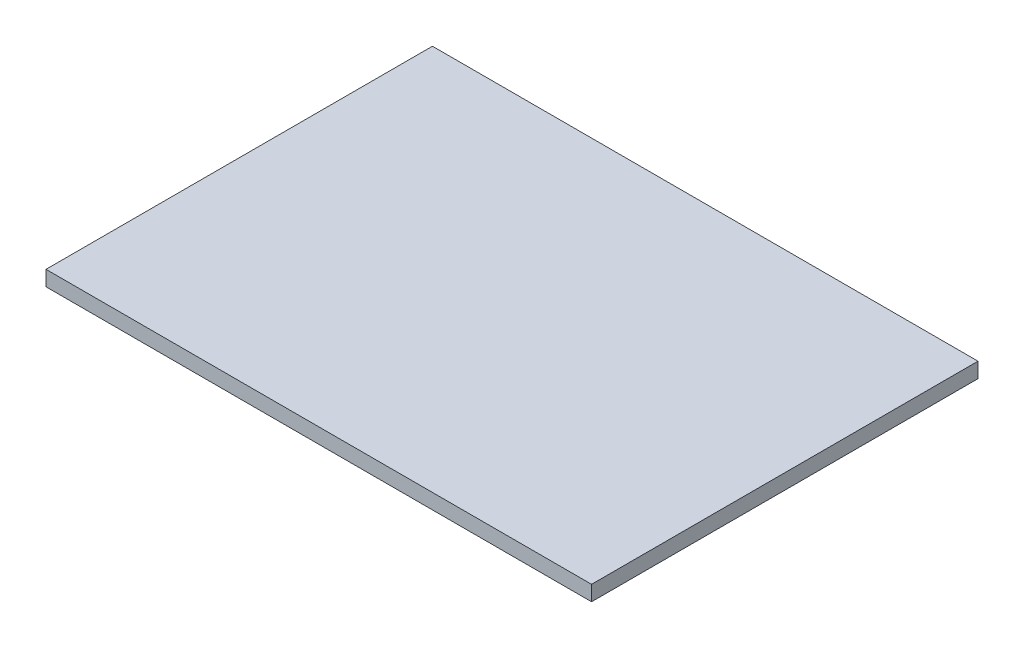
ISO-10303-21;
HEADER;
FILE_DESCRIPTION(('STEP AP214'),'2;1');
FILE_NAME('part.step','',(''),(''),'','','');
FILE_SCHEMA(('AUTOMOTIVE_DESIGN { 1 0 10303 214 1 1 1 1 }'));
ENDSEC;
DATA;
#1=APPLICATION_CONTEXT('core data for automotive mechanical design processes');
#2=APPLICATION_PROTOCOL_DEFINITION('international standard','automotive_design',2000,#1);
#3=PRODUCT_CONTEXT('',#1,'mechanical');
#4=PRODUCT('Part','Part','',(#3));
#5=PRODUCT_RELATED_PRODUCT_CATEGORY('part','',(#4));
#6=PRODUCT_DEFINITION_FORMATION('','',#4);
#7=PRODUCT_DEFINITION_CONTEXT('part definition',#1,'design');
#8=PRODUCT_DEFINITION('design','',#6,#7);
#9=PRODUCT_DEFINITION_SHAPE('','',#8);
#10=(LENGTH_UNIT() NAMED_UNIT(*) SI_UNIT(.MILLI.,.METRE.));
#11=(NAMED_UNIT(*) PLANE_ANGLE_UNIT() SI_UNIT($,.RADIAN.));
#12=(NAMED_UNIT(*) SI_UNIT($,.STERADIAN.) SOLID_ANGLE_UNIT());
#13=UNCERTAINTY_MEASURE_WITH_UNIT(LENGTH_MEASURE(1.E-05),#10,'distance_accuracy_value','');
#14=(GEOMETRIC_REPRESENTATION_CONTEXT(3) GLOBAL_UNCERTAINTY_ASSIGNED_CONTEXT((#13)) GLOBAL_UNIT_ASSIGNED_CONTEXT((#10,
#11,#12)) REPRESENTATION_CONTEXT('',''));
#15=CARTESIAN_POINT('',(0.,0.,0.));
#16=DIRECTION('',(0.,0.,1.));
#17=DIRECTION('',(1.,0.,0.));
#18=AXIS2_PLACEMENT_3D('',#15,#16,#17);
#19=CARTESIAN_POINT('',(18.,1.,-12.75));
#20=DIRECTION('',(-1.,0.,0.));
#21=DIRECTION('',(0.,0.,1.));
#22=AXIS2_PLACEMENT_3D('',#19,#20,#21);
#23=PLANE('',#22);
#24=DIRECTION('',(0.,0.,-1.));
#25=VECTOR('',#24,1.);
#26=CARTESIAN_POINT('',(18.,0.,-12.75));
#27=LINE('',#26,#25);
#28=CARTESIAN_POINT('',(18.,0.,12.75));
#29=VERTEX_POINT('',#28);
#30=CARTESIAN_POINT('',(18.,0.,-12.75));
#31=VERTEX_POINT('',#30);
#32=EDGE_CURVE('E102',#29,#31,#27,.T.);
#33=ORIENTED_EDGE('',*,*,#32,.T.);
#34=DIRECTION('',(0.,-1.,0.));
#35=VECTOR('',#34,1.);
#36=CARTESIAN_POINT('',(18.,1.,-12.75));
#37=LINE('',#36,#35);
#38=CARTESIAN_POINT('',(18.,1.,-12.75));
#39=VERTEX_POINT('',#38);
#40=EDGE_CURVE('E11',#39,#31,#37,.T.);
#41=ORIENTED_EDGE('',*,*,#40,.F.);
#42=DIRECTION('',(0.,0.,-1.));
#43=VECTOR('',#42,1.);
#44=CARTESIAN_POINT('',(18.,1.,-12.75));
#45=LINE('',#44,#43);
#46=CARTESIAN_POINT('',(18.,1.,12.75));
#47=VERTEX_POINT('',#46);
#48=EDGE_CURVE('E90',#47,#39,#45,.T.);
#49=ORIENTED_EDGE('',*,*,#48,.F.);
#50=DIRECTION('',(0.,-1.,0.));
#51=VECTOR('',#50,1.);
#52=CARTESIAN_POINT('',(18.,1.,12.75));
#53=LINE('',#52,#51);
#54=EDGE_CURVE('E98',#47,#29,#53,.T.);
#55=ORIENTED_EDGE('',*,*,#54,.T.);
#56=EDGE_LOOP('',(#33,#41,#49,#55));
#57=FACE_BOUND('',#56,.T.);
#58=ADVANCED_FACE('F39',(#57),#23,.F.);
#59=CARTESIAN_POINT('',(-18.,1.,-12.75));
#60=DIRECTION('',(0.,0.,1.));
#61=DIRECTION('',(1.,0.,0.));
#62=AXIS2_PLACEMENT_3D('',#59,#60,#61);
#63=PLANE('',#62);
#64=DIRECTION('',(-1.,0.,0.));
#65=VECTOR('',#64,1.);
#66=CARTESIAN_POINT('',(-18.,0.,-12.75));
#67=LINE('',#66,#65);
#68=CARTESIAN_POINT('',(-18.,0.,-12.75));
#69=VERTEX_POINT('',#68);
#70=EDGE_CURVE('E94',#31,#69,#67,.T.);
#71=ORIENTED_EDGE('',*,*,#70,.T.);
#72=DIRECTION('',(0.,-1.,0.));
#73=VECTOR('',#72,1.);
#74=CARTESIAN_POINT('',(-18.,1.,-12.75));
#75=LINE('',#74,#73);
#76=CARTESIAN_POINT('',(-18.,1.,-12.75));
#77=VERTEX_POINT('',#76);
#78=EDGE_CURVE('E47',#77,#69,#75,.T.);
#79=ORIENTED_EDGE('',*,*,#78,.F.);
#80=DIRECTION('',(-1.,0.,0.));
#81=VECTOR('',#80,1.);
#82=CARTESIAN_POINT('',(-18.,1.,-12.75));
#83=LINE('',#82,#81);
#84=EDGE_CURVE('E85',#39,#77,#83,.T.);
#85=ORIENTED_EDGE('',*,*,#84,.F.);
#86=ORIENTED_EDGE('',*,*,#40,.T.);
#87=EDGE_LOOP('',(#71,#79,#85,#86));
#88=FACE_BOUND('',#87,.T.);
#89=ADVANCED_FACE('F93',(#88),#63,.F.);
#90=CARTESIAN_POINT('',(-18.,1.,-12.75));
#91=DIRECTION('',(1.,0.,0.));
#92=DIRECTION('',(0.,0.,-1.));
#93=AXIS2_PLACEMENT_3D('',#90,#91,#92);
#94=PLANE('',#93);
#95=DIRECTION('',(0.,0.,1.));
#96=VECTOR('',#95,1.);
#97=CARTESIAN_POINT('',(-18.,0.,-12.75));
#98=LINE('',#97,#96);
#99=CARTESIAN_POINT('',(-18.,0.,12.75));
#100=VERTEX_POINT('',#99);
#101=EDGE_CURVE('E72',#69,#100,#98,.T.);
#102=ORIENTED_EDGE('',*,*,#101,.T.);
#103=DIRECTION('',(0.,-1.,0.));
#104=VECTOR('',#103,1.);
#105=CARTESIAN_POINT('',(-18.,1.,12.75));
#106=LINE('',#105,#104);
#107=CARTESIAN_POINT('',(-18.,1.,12.75));
#108=VERTEX_POINT('',#107);
#109=EDGE_CURVE('E95',#108,#100,#106,.T.);
#110=ORIENTED_EDGE('',*,*,#109,.F.);
#111=DIRECTION('',(0.,0.,1.));
#112=VECTOR('',#111,1.);
#113=CARTESIAN_POINT('',(-18.,1.,-12.75));
#114=LINE('',#113,#112);
#115=EDGE_CURVE('E88',#77,#108,#114,.T.);
#116=ORIENTED_EDGE('',*,*,#115,.F.);
#117=ORIENTED_EDGE('',*,*,#78,.T.);
#118=EDGE_LOOP('',(#102,#110,#116,#117));
#119=FACE_BOUND('',#118,.T.);
#120=ADVANCED_FACE('F96',(#119),#94,.F.);
#121=CARTESIAN_POINT('',(-18.,1.,12.75));
#122=DIRECTION('',(0.,0.,-1.));
#123=DIRECTION('',(-1.,0.,0.));
#124=AXIS2_PLACEMENT_3D('',#121,#122,#123);
#125=PLANE('',#124);
#126=DIRECTION('',(1.,0.,0.));
#127=VECTOR('',#126,1.);
#128=CARTESIAN_POINT('',(-18.,0.,12.75));
#129=LINE('',#128,#127);
#130=EDGE_CURVE('E78',#100,#29,#129,.T.);
#131=ORIENTED_EDGE('',*,*,#130,.T.);
#132=ORIENTED_EDGE('',*,*,#54,.F.);
#133=DIRECTION('',(1.,0.,0.));
#134=VECTOR('',#133,1.);
#135=CARTESIAN_POINT('',(-18.,1.,12.75));
#136=LINE('',#135,#134);
#137=EDGE_CURVE('E55',#108,#47,#136,.T.);
#138=ORIENTED_EDGE('',*,*,#137,.F.);
#139=ORIENTED_EDGE('',*,*,#109,.T.);
#140=EDGE_LOOP('',(#131,#132,#138,#139));
#141=FACE_BOUND('',#140,.T.);
#142=ADVANCED_FACE('F109',(#141),#125,.F.);
#143=CARTESIAN_POINT('',(0.,1.,0.));
#144=DIRECTION('',(0.,1.,0.));
#145=DIRECTION('',(0.,0.,1.));
#146=AXIS2_PLACEMENT_3D('',#143,#144,#145);
#147=PLANE('',#146);
#148=ORIENTED_EDGE('',*,*,#48,.T.);
#149=ORIENTED_EDGE('',*,*,#84,.T.);
#150=ORIENTED_EDGE('',*,*,#115,.T.);
#151=ORIENTED_EDGE('',*,*,#137,.T.);
#152=EDGE_LOOP('',(#148,#149,#150,#151));
#153=FACE_BOUND('',#152,.T.);
#154=ADVANCED_FACE('F86',(#153),#147,.T.);
#155=CARTESIAN_POINT('',(0.,0.,0.));
#156=DIRECTION('',(0.,1.,0.));
#157=DIRECTION('',(0.,0.,1.));
#158=AXIS2_PLACEMENT_3D('',#155,#156,#157);
#159=PLANE('',#158);
#160=ORIENTED_EDGE('',*,*,#32,.F.);
#161=ORIENTED_EDGE('',*,*,#130,.F.);
#162=ORIENTED_EDGE('',*,*,#101,.F.);
#163=ORIENTED_EDGE('',*,*,#70,.F.);
#164=EDGE_LOOP('',(#160,#161,#162,#163));
#165=FACE_BOUND('',#164,.T.);
#166=ADVANCED_FACE('F112',(#165),#159,.F.);
#167=CLOSED_SHELL('',(#58,#89,#120,#142,#154,#166));
#168=MANIFOLD_SOLID_BREP('B2',#167);
#169=ADVANCED_BREP_SHAPE_REPRESENTATION('',(#18,#168),#14);
#170=SHAPE_DEFINITION_REPRESENTATION(#9,#169);
ENDSEC;
END-ISO-10303-21;
